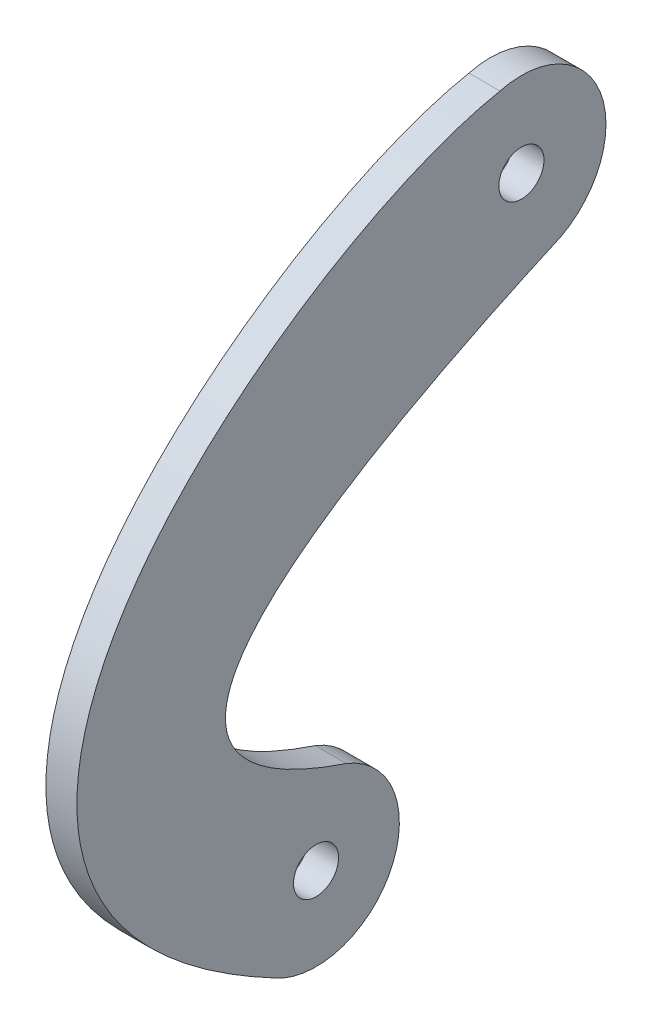
ISO-10303-21;
HEADER;
FILE_DESCRIPTION(('STEP AP214'),'2;1');
FILE_NAME('part.step','',(''),(''),'','','');
FILE_SCHEMA(('AUTOMOTIVE_DESIGN { 1 0 10303 214 1 1 1 1 }'));
ENDSEC;
DATA;
#1=APPLICATION_CONTEXT('core data for automotive mechanical design processes');
#2=APPLICATION_PROTOCOL_DEFINITION('international standard','automotive_design',2000,#1);
#3=PRODUCT_CONTEXT('',#1,'mechanical');
#4=PRODUCT('Part','Part','',(#3));
#5=PRODUCT_RELATED_PRODUCT_CATEGORY('part','',(#4));
#6=PRODUCT_DEFINITION_FORMATION('','',#4);
#7=PRODUCT_DEFINITION_CONTEXT('part definition',#1,'design');
#8=PRODUCT_DEFINITION('design','',#6,#7);
#9=PRODUCT_DEFINITION_SHAPE('','',#8);
#10=(LENGTH_UNIT() NAMED_UNIT(*) SI_UNIT(.MILLI.,.METRE.));
#11=(NAMED_UNIT(*) PLANE_ANGLE_UNIT() SI_UNIT($,.RADIAN.));
#12=(NAMED_UNIT(*) SI_UNIT($,.STERADIAN.) SOLID_ANGLE_UNIT());
#13=UNCERTAINTY_MEASURE_WITH_UNIT(LENGTH_MEASURE(1.E-05),#10,'distance_accuracy_value','');
#14=(GEOMETRIC_REPRESENTATION_CONTEXT(3) GLOBAL_UNCERTAINTY_ASSIGNED_CONTEXT((#13)) GLOBAL_UNIT_ASSIGNED_CONTEXT((#10,
#11,#12)) REPRESENTATION_CONTEXT('',''));
#15=CARTESIAN_POINT('',(0.,0.,0.));
#16=DIRECTION('',(0.,0.,1.));
#17=DIRECTION('',(1.,0.,0.));
#18=AXIS2_PLACEMENT_3D('',#15,#16,#17);
#19=CARTESIAN_POINT('',(5.5,-59.6476351681023,64.0307667915618));
#20=DIRECTION('',(-1.,0.,0.));
#21=DIRECTION('',(0.,0.,1.));
#22=AXIS2_PLACEMENT_3D('',#19,#20,#21);
#23=PLANE('',#22);
#24=CARTESIAN_POINT('',(5.5,-13.1483440004324,16.5714815437697));
#25=DIRECTION('',(1.,0.,0.));
#26=DIRECTION('',(0.,0.,-1.));
#27=AXIS2_PLACEMENT_3D('',#24,#25,#26);
#28=CIRCLE('',#27,3.9999999961297);
#29=CARTESIAN_POINT('',(5.5,-13.1483440004324,12.57148154764));
#30=VERTEX_POINT('',#29);
#31=EDGE_CURVE('E140',#30,#30,#28,.T.);
#32=ORIENTED_EDGE('',*,*,#31,.F.);
#33=EDGE_LOOP('',(#32));
#34=FACE_BOUND('',#33,.T.);
#35=CARTESIAN_POINT('',(5.5,-88.2989146483288,47.637725768516));
#36=CARTESIAN_POINT('',(5.5,-72.902178798754,93.9277076930342));
#37=CARTESIAN_POINT('',(5.5,-47.9256612642855,57.7614714678497));
#38=CARTESIAN_POINT('',(5.5,-26.3986465073711,9.54087108132664));
#39=B_SPLINE_CURVE_WITH_KNOTS('',3,(#35,#36,#37,#38),.UNSPECIFIED.,.F.,.F.,(4,4),(0.,1.),.UNSPECIFIED.);
#40=CARTESIAN_POINT('',(5.5,-88.2989146483286,47.6377257685166));
#41=VERTEX_POINT('',#40);
#42=CARTESIAN_POINT('',(5.5,-26.3986465073711,9.54087108132664));
#43=VERTEX_POINT('',#42);
#44=EDGE_CURVE('E82',#41,#43,#39,.T.);
#45=ORIENTED_EDGE('',*,*,#44,.T.);
#46=CARTESIAN_POINT('',(5.5,-13.1483440004324,16.5714815437697));
#47=DIRECTION('',(1.,0.,0.));
#48=DIRECTION('',(0.,0.,-1.));
#49=AXIS2_PLACEMENT_3D('',#46,#47,#48);
#50=CIRCLE('',#49,15.);
#51=CARTESIAN_POINT('',(5.5,1.36139958119566,20.375077368171));
#52=VERTEX_POINT('',#51);
#53=EDGE_CURVE('E77',#43,#52,#50,.T.);
#54=ORIENTED_EDGE('',*,*,#53,.T.);
#55=CARTESIAN_POINT('',(5.5,1.36139958119566,20.375077368171));
#56=CARTESIAN_POINT('',(5.5,-6.19557295671377,59.74434709285));
#57=CARTESIAN_POINT('',(5.5,-71.3892289801594,142.435177789636));
#58=CARTESIAN_POINT('',(5.5,-114.8456980353,60.4239436764858));
#59=B_SPLINE_CURVE_WITH_KNOTS('',3,(#55,#56,#57,#58),.UNSPECIFIED.,.F.,.F.,(4,4),(0.,1.),.UNSPECIFIED.);
#60=CARTESIAN_POINT('',(5.5,-114.8456980353,60.4239436764858));
#61=VERTEX_POINT('',#60);
#62=EDGE_CURVE('E80',#52,#61,#59,.T.);
#63=ORIENTED_EDGE('',*,*,#62,.T.);
#64=CARTESIAN_POINT('',(5.5,-102.070572255321,52.9963335611592));
#65=DIRECTION('',(1.,0.,0.));
#66=DIRECTION('',(0.,0.,-1.));
#67=AXIS2_PLACEMENT_3D('',#64,#65,#66);
#68=CIRCLE('',#67,14.7774568420818);
#69=EDGE_CURVE('E47',#61,#41,#68,.T.);
#70=ORIENTED_EDGE('',*,*,#69,.T.);
#71=EDGE_LOOP('',(#45,#54,#63,#70));
#72=FACE_BOUND('',#71,.T.);
#73=CARTESIAN_POINT('',(5.5,-102.070572255321,52.9963335611592));
#74=DIRECTION('',(1.,0.,0.));
#75=DIRECTION('',(0.,0.,-1.));
#76=AXIS2_PLACEMENT_3D('',#73,#74,#75);
#77=CIRCLE('',#76,4.00000000014302);
#78=CARTESIAN_POINT('',(5.5,-102.070572255321,48.9963335610162));
#79=VERTEX_POINT('',#78);
#80=EDGE_CURVE('E131',#79,#79,#77,.T.);
#81=ORIENTED_EDGE('',*,*,#80,.F.);
#82=EDGE_LOOP('',(#81));
#83=FACE_BOUND('',#82,.T.);
#84=ADVANCED_FACE('F29',(#34,#72,#83),#23,.F.);
#85=CARTESIAN_POINT('',(0.,-59.6476351681023,64.0307667915618));
#86=DIRECTION('',(-1.,0.,0.));
#87=DIRECTION('',(0.,0.,1.));
#88=AXIS2_PLACEMENT_3D('',#85,#86,#87);
#89=PLANE('',#88);
#90=CARTESIAN_POINT('',(0.,-13.1483440004324,16.5714815437697));
#91=DIRECTION('',(1.,0.,0.));
#92=DIRECTION('',(0.,0.,-1.));
#93=AXIS2_PLACEMENT_3D('',#90,#91,#92);
#94=CIRCLE('',#93,3.9999999961297);
#95=CARTESIAN_POINT('',(0.,-13.1483440004324,12.57148154764));
#96=VERTEX_POINT('',#95);
#97=EDGE_CURVE('E137',#96,#96,#94,.T.);
#98=ORIENTED_EDGE('',*,*,#97,.T.);
#99=EDGE_LOOP('',(#98));
#100=FACE_BOUND('',#99,.T.);
#101=CARTESIAN_POINT('',(0.,-88.2989146483288,47.637725768516));
#102=CARTESIAN_POINT('',(0.,-72.902178798754,93.9277076930342));
#103=CARTESIAN_POINT('',(0.,-47.9256612642855,57.7614714678497));
#104=CARTESIAN_POINT('',(0.,-26.3986465073711,9.54087108132664));
#105=B_SPLINE_CURVE_WITH_KNOTS('',3,(#101,#102,#103,#104),.UNSPECIFIED.,.F.,.F.,(4,4),(0.,1.),.UNSPECIFIED.);
#106=CARTESIAN_POINT('',(0.,-88.2989146483286,47.6377257685166));
#107=VERTEX_POINT('',#106);
#108=CARTESIAN_POINT('',(0.,-26.3986465073711,9.54087108132664));
#109=VERTEX_POINT('',#108);
#110=EDGE_CURVE('E143',#107,#109,#105,.T.);
#111=ORIENTED_EDGE('',*,*,#110,.F.);
#112=CARTESIAN_POINT('',(0.,-102.070572255321,52.9963335611592));
#113=DIRECTION('',(1.,0.,0.));
#114=DIRECTION('',(0.,0.,-1.));
#115=AXIS2_PLACEMENT_3D('',#112,#113,#114);
#116=CIRCLE('',#115,14.7774568420818);
#117=CARTESIAN_POINT('',(0.,-114.8456980353,60.4239436764858));
#118=VERTEX_POINT('',#117);
#119=EDGE_CURVE('E70',#118,#107,#116,.T.);
#120=ORIENTED_EDGE('',*,*,#119,.F.);
#121=CARTESIAN_POINT('',(0.,1.36139958119566,20.375077368171));
#122=CARTESIAN_POINT('',(0.,-6.19557295671377,59.74434709285));
#123=CARTESIAN_POINT('',(0.,-71.3892289801594,142.435177789636));
#124=CARTESIAN_POINT('',(0.,-114.8456980353,60.4239436764858));
#125=B_SPLINE_CURVE_WITH_KNOTS('',3,(#121,#122,#123,#124),.UNSPECIFIED.,.F.,.F.,(4,4),(0.,1.),.UNSPECIFIED.);
#126=CARTESIAN_POINT('',(0.,1.36139958119566,20.375077368171));
#127=VERTEX_POINT('',#126);
#128=EDGE_CURVE('E64',#127,#118,#125,.T.);
#129=ORIENTED_EDGE('',*,*,#128,.F.);
#130=CARTESIAN_POINT('',(0.,-13.1483440004324,16.5714815437697));
#131=DIRECTION('',(1.,0.,0.));
#132=DIRECTION('',(0.,0.,-1.));
#133=AXIS2_PLACEMENT_3D('',#130,#131,#132);
#134=CIRCLE('',#133,15.);
#135=EDGE_CURVE('E86',#109,#127,#134,.T.);
#136=ORIENTED_EDGE('',*,*,#135,.F.);
#137=EDGE_LOOP('',(#111,#120,#129,#136));
#138=FACE_BOUND('',#137,.T.);
#139=CARTESIAN_POINT('',(0.,-102.070572255321,52.9963335611592));
#140=DIRECTION('',(1.,0.,0.));
#141=DIRECTION('',(0.,0.,-1.));
#142=AXIS2_PLACEMENT_3D('',#139,#140,#141);
#143=CIRCLE('',#142,4.00000000014302);
#144=CARTESIAN_POINT('',(0.,-102.070572255321,48.9963335610162));
#145=VERTEX_POINT('',#144);
#146=EDGE_CURVE('E134',#145,#145,#143,.T.);
#147=ORIENTED_EDGE('',*,*,#146,.T.);
#148=EDGE_LOOP('',(#147));
#149=FACE_BOUND('',#148,.T.);
#150=ADVANCED_FACE('F108',(#100,#138,#149),#89,.T.);
#151=DIRECTION('',(-1.,0.,0.));
#152=VECTOR('',#151,1.);
#153=SURFACE_OF_LINEAR_EXTRUSION('',#39,#152);
#154=ORIENTED_EDGE('',*,*,#110,.T.);
#155=DIRECTION('',(-1.,0.,0.));
#156=VECTOR('',#155,1.);
#157=CARTESIAN_POINT('',(5.5,-26.3986465073711,9.54087108132664));
#158=LINE('',#157,#156);
#159=EDGE_CURVE('E11',#43,#109,#158,.T.);
#160=ORIENTED_EDGE('',*,*,#159,.F.);
#161=ORIENTED_EDGE('',*,*,#44,.F.);
#162=DIRECTION('',(-1.,0.,0.));
#163=VECTOR('',#162,1.);
#164=CARTESIAN_POINT('',(5.5,-88.2989146483286,47.6377257685166));
#165=LINE('',#164,#163);
#166=EDGE_CURVE('E90',#41,#107,#165,.T.);
#167=ORIENTED_EDGE('',*,*,#166,.T.);
#168=EDGE_LOOP('',(#154,#160,#161,#167));
#169=FACE_BOUND('',#168,.T.);
#170=ADVANCED_FACE('F31',(#169),#153,.F.);
#171=CARTESIAN_POINT('',(5.5,-13.1483440004324,16.5714815437697));
#172=DIRECTION('',(-1.,0.,0.));
#173=DIRECTION('',(0.,0.,1.));
#174=AXIS2_PLACEMENT_3D('',#171,#172,#173);
#175=CYLINDRICAL_SURFACE('',#174,15.);
#176=ORIENTED_EDGE('',*,*,#135,.T.);
#177=DIRECTION('',(-1.,0.,0.));
#178=VECTOR('',#177,1.);
#179=CARTESIAN_POINT('',(5.5,1.36139958119566,20.375077368171));
#180=LINE('',#179,#178);
#181=EDGE_CURVE('E39',#52,#127,#180,.T.);
#182=ORIENTED_EDGE('',*,*,#181,.F.);
#183=ORIENTED_EDGE('',*,*,#53,.F.);
#184=ORIENTED_EDGE('',*,*,#159,.T.);
#185=EDGE_LOOP('',(#176,#182,#183,#184));
#186=FACE_BOUND('',#185,.T.);
#187=ADVANCED_FACE('F85',(#186),#175,.T.);
#188=DIRECTION('',(-1.,0.,0.));
#189=VECTOR('',#188,1.);
#190=SURFACE_OF_LINEAR_EXTRUSION('',#59,#189);
#191=ORIENTED_EDGE('',*,*,#128,.T.);
#192=DIRECTION('',(-1.,0.,0.));
#193=VECTOR('',#192,1.);
#194=CARTESIAN_POINT('',(5.5,-114.8456980353,60.4239436764858));
#195=LINE('',#194,#193);
#196=EDGE_CURVE('E87',#61,#118,#195,.T.);
#197=ORIENTED_EDGE('',*,*,#196,.F.);
#198=ORIENTED_EDGE('',*,*,#62,.F.);
#199=ORIENTED_EDGE('',*,*,#181,.T.);
#200=EDGE_LOOP('',(#191,#197,#198,#199));
#201=FACE_BOUND('',#200,.T.);
#202=ADVANCED_FACE('F88',(#201),#190,.F.);
#203=CARTESIAN_POINT('',(5.5,-102.070572255321,52.9963335611592));
#204=DIRECTION('',(-1.,0.,0.));
#205=DIRECTION('',(0.,0.,1.));
#206=AXIS2_PLACEMENT_3D('',#203,#204,#205);
#207=CYLINDRICAL_SURFACE('',#206,14.7774568420818);
#208=ORIENTED_EDGE('',*,*,#119,.T.);
#209=ORIENTED_EDGE('',*,*,#166,.F.);
#210=ORIENTED_EDGE('',*,*,#69,.F.);
#211=ORIENTED_EDGE('',*,*,#196,.T.);
#212=EDGE_LOOP('',(#208,#209,#210,#211));
#213=FACE_BOUND('',#212,.T.);
#214=ADVANCED_FACE('F102',(#213),#207,.T.);
#215=CARTESIAN_POINT('',(5.5,-13.1483440004324,16.5714815437697));
#216=DIRECTION('',(-1.,0.,0.));
#217=DIRECTION('',(0.,0.,1.));
#218=AXIS2_PLACEMENT_3D('',#215,#216,#217);
#219=CYLINDRICAL_SURFACE('',#218,3.9999999961297);
#220=ORIENTED_EDGE('',*,*,#31,.T.);
#221=EDGE_LOOP('',(#220));
#222=FACE_BOUND('',#221,.T.);
#223=ORIENTED_EDGE('',*,*,#97,.F.);
#224=EDGE_LOOP('',(#223));
#225=FACE_BOUND('',#224,.T.);
#226=ADVANCED_FACE('F119',(#222,#225),#219,.F.);
#227=CARTESIAN_POINT('',(5.5,-102.070572255321,52.9963335611592));
#228=DIRECTION('',(-1.,0.,0.));
#229=DIRECTION('',(0.,0.,1.));
#230=AXIS2_PLACEMENT_3D('',#227,#228,#229);
#231=CYLINDRICAL_SURFACE('',#230,4.00000000014302);
#232=ORIENTED_EDGE('',*,*,#80,.T.);
#233=EDGE_LOOP('',(#232));
#234=FACE_BOUND('',#233,.T.);
#235=ORIENTED_EDGE('',*,*,#146,.F.);
#236=EDGE_LOOP('',(#235));
#237=FACE_BOUND('',#236,.T.);
#238=ADVANCED_FACE('F122',(#234,#237),#231,.F.);
#239=CLOSED_SHELL('',(#84,#150,#170,#187,#202,#214,#226,#238));
#240=MANIFOLD_SOLID_BREP('B2',#239);
#241=ADVANCED_BREP_SHAPE_REPRESENTATION('',(#18,#240),#14);
#242=SHAPE_DEFINITION_REPRESENTATION(#9,#241);
ENDSEC;
END-ISO-10303-21;
